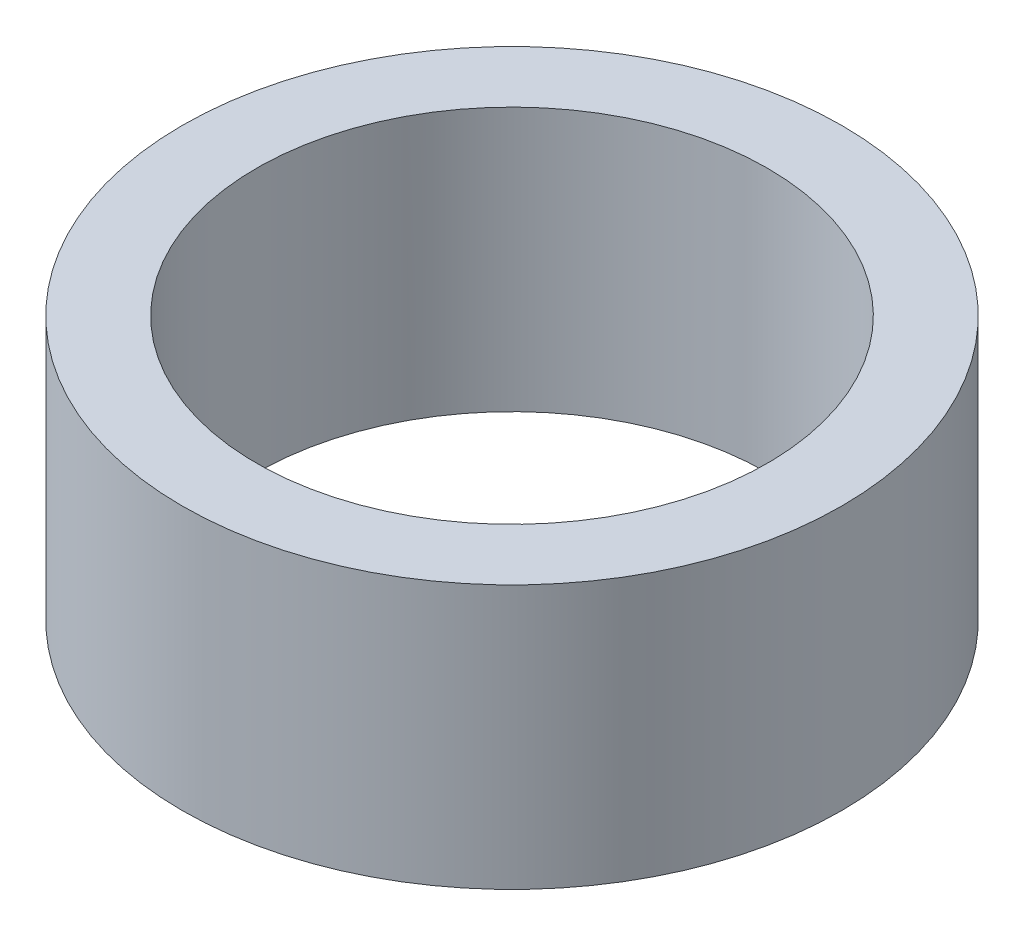
ISO-10303-21;
HEADER;
FILE_DESCRIPTION(('STEP AP214'),'2;1');
FILE_NAME('part.step','',(''),(''),'','','');
FILE_SCHEMA(('AUTOMOTIVE_DESIGN { 1 0 10303 214 1 1 1 1 }'));
ENDSEC;
DATA;
#1=APPLICATION_CONTEXT('core data for automotive mechanical design processes');
#2=APPLICATION_PROTOCOL_DEFINITION('international standard','automotive_design',2000,#1);
#3=PRODUCT_CONTEXT('',#1,'mechanical');
#4=PRODUCT('Part','Part','',(#3));
#5=PRODUCT_RELATED_PRODUCT_CATEGORY('part','',(#4));
#6=PRODUCT_DEFINITION_FORMATION('','',#4);
#7=PRODUCT_DEFINITION_CONTEXT('part definition',#1,'design');
#8=PRODUCT_DEFINITION('design','',#6,#7);
#9=PRODUCT_DEFINITION_SHAPE('','',#8);
#10=(LENGTH_UNIT() NAMED_UNIT(*) SI_UNIT(.MILLI.,.METRE.));
#11=(NAMED_UNIT(*) PLANE_ANGLE_UNIT() SI_UNIT($,.RADIAN.));
#12=(NAMED_UNIT(*) SI_UNIT($,.STERADIAN.) SOLID_ANGLE_UNIT());
#13=UNCERTAINTY_MEASURE_WITH_UNIT(LENGTH_MEASURE(1.E-05),#10,'distance_accuracy_value','');
#14=(GEOMETRIC_REPRESENTATION_CONTEXT(3) GLOBAL_UNCERTAINTY_ASSIGNED_CONTEXT((#13)) GLOBAL_UNIT_ASSIGNED_CONTEXT((#10,
#11,#12)) REPRESENTATION_CONTEXT('',''));
#15=CARTESIAN_POINT('',(0.,0.,0.));
#16=DIRECTION('',(0.,0.,1.));
#17=DIRECTION('',(1.,0.,0.));
#18=AXIS2_PLACEMENT_3D('',#15,#16,#17);
#19=CARTESIAN_POINT('',(0.,8.,0.));
#20=DIRECTION('',(0.,1.,0.));
#21=DIRECTION('',(0.,0.,1.));
#22=AXIS2_PLACEMENT_3D('',#19,#20,#21);
#23=PLANE('',#22);
#24=CARTESIAN_POINT('',(0.,8.,0.));
#25=DIRECTION('',(0.,1.,0.));
#26=DIRECTION('',(0.,0.,1.));
#27=AXIS2_PLACEMENT_3D('',#24,#25,#26);
#28=CIRCLE('',#27,10.);
#29=CARTESIAN_POINT('',(0.,8.,10.));
#30=VERTEX_POINT('',#29);
#31=EDGE_CURVE('E11',#30,#30,#28,.T.);
#32=ORIENTED_EDGE('',*,*,#31,.T.);
#33=EDGE_LOOP('',(#32));
#34=FACE_BOUND('',#33,.T.);
#35=CARTESIAN_POINT('',(0.,8.,0.));
#36=DIRECTION('',(0.,-1.,0.));
#37=DIRECTION('',(0.,0.,-1.));
#38=AXIS2_PLACEMENT_3D('',#35,#36,#37);
#39=CIRCLE('',#38,7.75);
#40=CARTESIAN_POINT('',(0.,8.,-7.75));
#41=VERTEX_POINT('',#40);
#42=EDGE_CURVE('E61',#41,#41,#39,.T.);
#43=ORIENTED_EDGE('',*,*,#42,.T.);
#44=EDGE_LOOP('',(#43));
#45=FACE_BOUND('',#44,.T.);
#46=ADVANCED_FACE('F50',(#34,#45),#23,.T.);
#47=CARTESIAN_POINT('',(0.,0.,0.));
#48=DIRECTION('',(0.,1.,0.));
#49=DIRECTION('',(0.,0.,1.));
#50=AXIS2_PLACEMENT_3D('',#47,#48,#49);
#51=PLANE('',#50);
#52=CARTESIAN_POINT('',(0.,0.,0.));
#53=DIRECTION('',(0.,1.,0.));
#54=DIRECTION('',(0.,0.,1.));
#55=AXIS2_PLACEMENT_3D('',#52,#53,#54);
#56=CIRCLE('',#55,10.);
#57=CARTESIAN_POINT('',(0.,0.,10.));
#58=VERTEX_POINT('',#57);
#59=EDGE_CURVE('E54',#58,#58,#56,.T.);
#60=ORIENTED_EDGE('',*,*,#59,.F.);
#61=EDGE_LOOP('',(#60));
#62=FACE_BOUND('',#61,.T.);
#63=CARTESIAN_POINT('',(0.,0.,0.));
#64=DIRECTION('',(0.,1.,0.));
#65=DIRECTION('',(0.,0.,1.));
#66=AXIS2_PLACEMENT_3D('',#63,#64,#65);
#67=CIRCLE('',#66,7.75);
#68=CARTESIAN_POINT('',(0.,0.,7.75));
#69=VERTEX_POINT('',#68);
#70=EDGE_CURVE('E63',#69,#69,#67,.T.);
#71=ORIENTED_EDGE('',*,*,#70,.T.);
#72=EDGE_LOOP('',(#71));
#73=FACE_BOUND('',#72,.T.);
#74=ADVANCED_FACE('F77',(#62,#73),#51,.F.);
#75=CARTESIAN_POINT('',(0.,8.,0.));
#76=DIRECTION('',(0.,-1.,0.));
#77=DIRECTION('',(0.,0.,-1.));
#78=AXIS2_PLACEMENT_3D('',#75,#76,#77);
#79=CYLINDRICAL_SURFACE('',#78,10.);
#80=ORIENTED_EDGE('',*,*,#31,.F.);
#81=EDGE_LOOP('',(#80));
#82=FACE_BOUND('',#81,.T.);
#83=ORIENTED_EDGE('',*,*,#59,.T.);
#84=EDGE_LOOP('',(#83));
#85=FACE_BOUND('',#84,.T.);
#86=ADVANCED_FACE('F52',(#82,#85),#79,.T.);
#87=CARTESIAN_POINT('',(0.,8.,0.));
#88=DIRECTION('',(0.,-1.,0.));
#89=DIRECTION('',(0.,0.,-1.));
#90=AXIS2_PLACEMENT_3D('',#87,#88,#89);
#91=CYLINDRICAL_SURFACE('',#90,7.75);
#92=ORIENTED_EDGE('',*,*,#70,.F.);
#93=EDGE_LOOP('',(#92));
#94=FACE_BOUND('',#93,.T.);
#95=ORIENTED_EDGE('',*,*,#42,.F.);
#96=EDGE_LOOP('',(#95));
#97=FACE_BOUND('',#96,.T.);
#98=ADVANCED_FACE('F70',(#94,#97),#91,.F.);
#99=CLOSED_SHELL('',(#46,#74,#86,#98));
#100=MANIFOLD_SOLID_BREP('B2',#99);
#101=ADVANCED_BREP_SHAPE_REPRESENTATION('',(#18,#100),#14);
#102=SHAPE_DEFINITION_REPRESENTATION(#9,#101);
ENDSEC;
END-ISO-10303-21;
